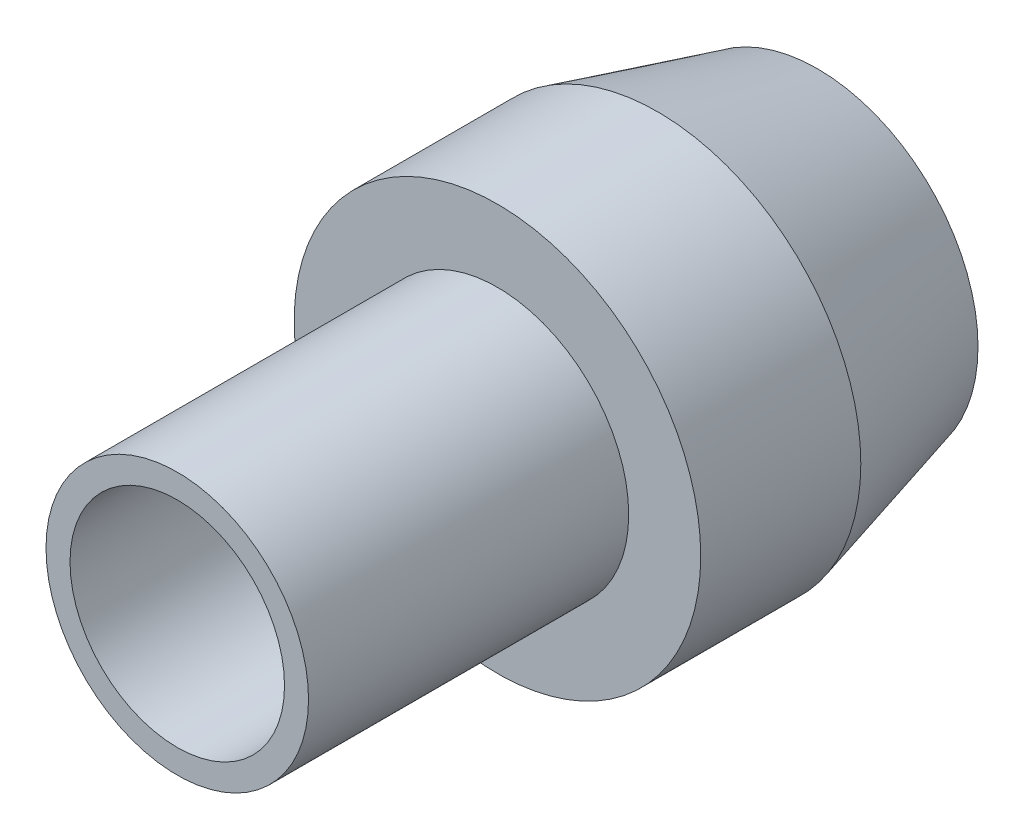
ISO-10303-21;
HEADER;
FILE_DESCRIPTION(('STEP AP214'),'2;1');
FILE_NAME('part.step','',(''),(''),'','','');
FILE_SCHEMA(('AUTOMOTIVE_DESIGN { 1 0 10303 214 1 1 1 1 }'));
ENDSEC;
DATA;
#1=APPLICATION_CONTEXT('core data for automotive mechanical design processes');
#2=APPLICATION_PROTOCOL_DEFINITION('international standard','automotive_design',2000,#1);
#3=PRODUCT_CONTEXT('',#1,'mechanical');
#4=PRODUCT('Part','Part','',(#3));
#5=PRODUCT_RELATED_PRODUCT_CATEGORY('part','',(#4));
#6=PRODUCT_DEFINITION_FORMATION('','',#4);
#7=PRODUCT_DEFINITION_CONTEXT('part definition',#1,'design');
#8=PRODUCT_DEFINITION('design','',#6,#7);
#9=PRODUCT_DEFINITION_SHAPE('','',#8);
#10=(LENGTH_UNIT() NAMED_UNIT(*) SI_UNIT(.MILLI.,.METRE.));
#11=(NAMED_UNIT(*) PLANE_ANGLE_UNIT() SI_UNIT($,.RADIAN.));
#12=(NAMED_UNIT(*) SI_UNIT($,.STERADIAN.) SOLID_ANGLE_UNIT());
#13=UNCERTAINTY_MEASURE_WITH_UNIT(LENGTH_MEASURE(1.E-05),#10,'distance_accuracy_value','');
#14=(GEOMETRIC_REPRESENTATION_CONTEXT(3) GLOBAL_UNCERTAINTY_ASSIGNED_CONTEXT((#13)) GLOBAL_UNIT_ASSIGNED_CONTEXT((#10,
#11,#12)) REPRESENTATION_CONTEXT('',''));
#15=CARTESIAN_POINT('',(0.,0.,0.));
#16=DIRECTION('',(0.,0.,1.));
#17=DIRECTION('',(1.,0.,0.));
#18=AXIS2_PLACEMENT_3D('',#15,#16,#17);
#19=CARTESIAN_POINT('',(0.,0.,20.));
#20=DIRECTION('',(0.,0.,1.));
#21=DIRECTION('',(1.,0.,0.));
#22=AXIS2_PLACEMENT_3D('',#19,#20,#21);
#23=PLANE('',#22);
#24=CARTESIAN_POINT('',(0.,0.,20.));
#25=DIRECTION('',(0.,0.,1.));
#26=DIRECTION('',(1.,0.,0.));
#27=AXIS2_PLACEMENT_3D('',#24,#25,#26);
#28=CIRCLE('',#27,12.7);
#29=CARTESIAN_POINT('',(12.7,0.,20.));
#30=VERTEX_POINT('',#29);
#31=EDGE_CURVE('E49',#30,#30,#28,.T.);
#32=ORIENTED_EDGE('',*,*,#31,.T.);
#33=EDGE_LOOP('',(#32));
#34=FACE_BOUND('',#33,.T.);
#35=CARTESIAN_POINT('',(0.,0.,20.));
#36=DIRECTION('',(0.,0.,1.));
#37=DIRECTION('',(1.,0.,0.));
#38=AXIS2_PLACEMENT_3D('',#35,#36,#37);
#39=CIRCLE('',#38,8.2);
#40=CARTESIAN_POINT('',(8.2,0.,20.));
#41=VERTEX_POINT('',#40);
#42=EDGE_CURVE('E59',#41,#41,#39,.T.);
#43=ORIENTED_EDGE('',*,*,#42,.F.);
#44=EDGE_LOOP('',(#43));
#45=FACE_BOUND('',#44,.T.);
#46=ADVANCED_FACE('F38',(#34,#45),#23,.T.);
#47=CARTESIAN_POINT('',(0.,0.,20.));
#48=DIRECTION('',(0.,0.,-1.));
#49=DIRECTION('',(-1.,0.,0.));
#50=AXIS2_PLACEMENT_3D('',#47,#48,#49);
#51=CYLINDRICAL_SURFACE('',#50,12.7);
#52=CARTESIAN_POINT('',(0.,0.,10.0000000000001));
#53=DIRECTION('',(0.,0.,1.));
#54=DIRECTION('',(1.,0.,0.));
#55=AXIS2_PLACEMENT_3D('',#52,#53,#54);
#56=CIRCLE('',#55,12.7);
#57=CARTESIAN_POINT('',(12.7,0.,10.0000000000001));
#58=VERTEX_POINT('',#57);
#59=EDGE_CURVE('E45',#58,#58,#56,.T.);
#60=ORIENTED_EDGE('',*,*,#59,.T.);
#61=EDGE_LOOP('',(#60));
#62=FACE_BOUND('',#61,.T.);
#63=ORIENTED_EDGE('',*,*,#31,.F.);
#64=EDGE_LOOP('',(#63));
#65=FACE_BOUND('',#64,.T.);
#66=ADVANCED_FACE('F84',(#62,#65),#51,.T.);
#67=CARTESIAN_POINT('',(0.,0.,20.));
#68=DIRECTION('',(0.,0.,-1.));
#69=DIRECTION('',(-1.,0.,0.));
#70=AXIS2_PLACEMENT_3D('',#67,#68,#69);
#71=CYLINDRICAL_SURFACE('',#70,6.7);
#72=CARTESIAN_POINT('',(0.,0.,0.));
#73=DIRECTION('',(0.,0.,1.));
#74=DIRECTION('',(1.,0.,0.));
#75=AXIS2_PLACEMENT_3D('',#72,#73,#74);
#76=CIRCLE('',#75,6.7);
#77=CARTESIAN_POINT('',(6.7,0.,0.));
#78=VERTEX_POINT('',#77);
#79=EDGE_CURVE('E53',#78,#78,#76,.T.);
#80=ORIENTED_EDGE('',*,*,#79,.F.);
#81=EDGE_LOOP('',(#80));
#82=FACE_BOUND('',#81,.T.);
#83=CARTESIAN_POINT('',(0.,0.,40.));
#84=DIRECTION('',(0.,0.,1.));
#85=DIRECTION('',(1.,0.,0.));
#86=AXIS2_PLACEMENT_3D('',#83,#84,#85);
#87=CIRCLE('',#86,6.7);
#88=CARTESIAN_POINT('',(6.7,0.,40.));
#89=VERTEX_POINT('',#88);
#90=EDGE_CURVE('E62',#89,#89,#87,.T.);
#91=ORIENTED_EDGE('',*,*,#90,.T.);
#92=EDGE_LOOP('',(#91));
#93=FACE_BOUND('',#92,.T.);
#94=ADVANCED_FACE('F68',(#82,#93),#71,.F.);
#95=CARTESIAN_POINT('',(0.,0.,0.));
#96=DIRECTION('',(0.,0.,1.));
#97=DIRECTION('',(1.,0.,0.));
#98=AXIS2_PLACEMENT_3D('',#95,#96,#97);
#99=PLANE('',#98);
#100=CARTESIAN_POINT('',(0.,0.,0.));
#101=DIRECTION('',(0.,0.,1.));
#102=DIRECTION('',(1.,0.,0.));
#103=AXIS2_PLACEMENT_3D('',#100,#101,#102);
#104=CIRCLE('',#103,10.0205080756888);
#105=CARTESIAN_POINT('',(10.0205080756888,0.,0.));
#106=VERTEX_POINT('',#105);
#107=EDGE_CURVE('E11',#106,#106,#104,.F.);
#108=ORIENTED_EDGE('',*,*,#107,.T.);
#109=EDGE_LOOP('',(#108));
#110=FACE_BOUND('',#109,.T.);
#111=ORIENTED_EDGE('',*,*,#79,.T.);
#112=EDGE_LOOP('',(#111));
#113=FACE_BOUND('',#112,.T.);
#114=ADVANCED_FACE('F73',(#110,#113),#99,.F.);
#115=CARTESIAN_POINT('',(0.,0.,40.));
#116=DIRECTION('',(0.,0.,1.));
#117=DIRECTION('',(1.,0.,0.));
#118=AXIS2_PLACEMENT_3D('',#115,#116,#117);
#119=PLANE('',#118);
#120=CARTESIAN_POINT('',(0.,0.,40.));
#121=DIRECTION('',(0.,0.,1.));
#122=DIRECTION('',(1.,0.,0.));
#123=AXIS2_PLACEMENT_3D('',#120,#121,#122);
#124=CIRCLE('',#123,8.2);
#125=CARTESIAN_POINT('',(8.2,0.,40.));
#126=VERTEX_POINT('',#125);
#127=EDGE_CURVE('E57',#126,#126,#124,.T.);
#128=ORIENTED_EDGE('',*,*,#127,.T.);
#129=EDGE_LOOP('',(#128));
#130=FACE_BOUND('',#129,.T.);
#131=ORIENTED_EDGE('',*,*,#90,.F.);
#132=EDGE_LOOP('',(#131));
#133=FACE_BOUND('',#132,.T.);
#134=ADVANCED_FACE('F70',(#130,#133),#119,.T.);
#135=CARTESIAN_POINT('',(0.,0.,40.));
#136=DIRECTION('',(0.,0.,-1.));
#137=DIRECTION('',(-1.,0.,0.));
#138=AXIS2_PLACEMENT_3D('',#135,#136,#137);
#139=CYLINDRICAL_SURFACE('',#138,8.2);
#140=ORIENTED_EDGE('',*,*,#127,.F.);
#141=EDGE_LOOP('',(#140));
#142=FACE_BOUND('',#141,.T.);
#143=ORIENTED_EDGE('',*,*,#42,.T.);
#144=EDGE_LOOP('',(#143));
#145=FACE_BOUND('',#144,.T.);
#146=ADVANCED_FACE('F72',(#142,#145),#139,.T.);
#147=CARTESIAN_POINT('',(0.,0.,10.0000000000001));
#148=DIRECTION('',(0.,0.,1.));
#149=DIRECTION('',(1.,0.,0.));
#150=AXIS2_PLACEMENT_3D('',#147,#148,#149);
#151=CONICAL_SURFACE('',#150,12.7,0.261799387799146);
#152=CARTESIAN_POINT('',(10.0205080756888,0.,0.));
#153=CARTESIAN_POINT('',(10.0484194499004,0.,0.104166666666666));
#154=CARTESIAN_POINT('',(10.0763308241119,0.,0.208333333333334));
#155=CARTESIAN_POINT('',(10.1321535725351,0.,0.41666666666667));
#156=CARTESIAN_POINT('',(10.1600649467467,0.,0.520833333333338));
#157=CARTESIAN_POINT('',(10.2158876951698,0.,0.729166666666673));
#158=CARTESIAN_POINT('',(10.2437990693814,0.,0.83333333333334));
#159=CARTESIAN_POINT('',(10.2996218178045,0.,1.04166666666668));
#160=CARTESIAN_POINT('',(10.3275331920161,0.,1.14583333333334));
#161=CARTESIAN_POINT('',(10.3833559404393,0.,1.35416666666668));
#162=CARTESIAN_POINT('',(10.4112673146508,0.,1.45833333333335));
#163=CARTESIAN_POINT('',(10.467090063074,0.,1.66666666666668));
#164=CARTESIAN_POINT('',(10.4950014372856,0.,1.77083333333335));
#165=CARTESIAN_POINT('',(10.5508241857087,0.,1.97916666666669));
#166=CARTESIAN_POINT('',(10.5787355599203,0.,2.08333333333335));
#167=CARTESIAN_POINT('',(10.6345583083434,0.,2.29166666666669));
#168=CARTESIAN_POINT('',(10.662469682555,0.,2.39583333333336));
#169=CARTESIAN_POINT('',(10.7182924309782,0.,2.60416666666669));
#170=CARTESIAN_POINT('',(10.7462038051897,0.,2.70833333333336));
#171=CARTESIAN_POINT('',(10.8020265536129,0.,2.9166666666667));
#172=CARTESIAN_POINT('',(10.8299379278245,0.,3.02083333333336));
#173=CARTESIAN_POINT('',(10.8857606762476,0.,3.2291666666667));
#174=CARTESIAN_POINT('',(10.9136720504592,0.,3.33333333333337));
#175=CARTESIAN_POINT('',(10.9694947988823,0.,3.5416666666667));
#176=CARTESIAN_POINT('',(10.9974061730939,0.,3.64583333333337));
#177=CARTESIAN_POINT('',(11.0532289215171,0.,3.85416666666671));
#178=CARTESIAN_POINT('',(11.0811402957286,0.,3.95833333333337));
#179=CARTESIAN_POINT('',(11.1369630441518,0.,4.16666666666671));
#180=CARTESIAN_POINT('',(11.1648744183634,0.,4.27083333333338));
#181=CARTESIAN_POINT('',(11.2206971667865,0.,4.47916666666671));
#182=CARTESIAN_POINT('',(11.2486085409981,0.,4.58333333333338));
#183=CARTESIAN_POINT('',(11.3044312894212,0.,4.79166666666672));
#184=CARTESIAN_POINT('',(11.3323426636328,0.,4.89583333333338));
#185=CARTESIAN_POINT('',(11.388165412056,0.,5.10416666666672));
#186=CARTESIAN_POINT('',(11.4160767862675,0.,5.20833333333339));
#187=CARTESIAN_POINT('',(11.4718995346907,0.,5.41666666666672));
#188=CARTESIAN_POINT('',(11.4998109089023,0.,5.52083333333339));
#189=CARTESIAN_POINT('',(11.5556336573254,0.,5.72916666666673));
#190=CARTESIAN_POINT('',(11.583545031537,0.,5.83333333333339));
#191=CARTESIAN_POINT('',(11.6393677799601,0.,6.04166666666673));
#192=CARTESIAN_POINT('',(11.6672791541717,0.,6.1458333333334));
#193=CARTESIAN_POINT('',(11.7231019025949,0.,6.35416666666673));
#194=CARTESIAN_POINT('',(11.7510132768064,0.,6.4583333333334));
#195=CARTESIAN_POINT('',(11.8068360252296,0.,6.66666666666674));
#196=CARTESIAN_POINT('',(11.8347473994412,0.,6.7708333333334));
#197=CARTESIAN_POINT('',(11.8905701478643,0.,6.97916666666674));
#198=CARTESIAN_POINT('',(11.9184815220759,0.,7.08333333333341));
#199=CARTESIAN_POINT('',(11.974304270499,0.,7.29166666666674));
#200=CARTESIAN_POINT('',(12.0022156447106,0.,7.39583333333341));
#201=CARTESIAN_POINT('',(12.0580383931338,0.,7.60416666666675));
#202=CARTESIAN_POINT('',(12.0859497673453,0.,7.70833333333341));
#203=CARTESIAN_POINT('',(12.1417725157685,0.,7.91666666666675));
#204=CARTESIAN_POINT('',(12.1696838899801,0.,8.02083333333342));
#205=CARTESIAN_POINT('',(12.2255066384032,0.,8.22916666666675));
#206=CARTESIAN_POINT('',(12.2534180126148,0.,8.33333333333342));
#207=CARTESIAN_POINT('',(12.3092407610379,0.,8.54166666666676));
#208=CARTESIAN_POINT('',(12.3371521352495,0.,8.64583333333343));
#209=CARTESIAN_POINT('',(12.3929748836727,0.,8.85416666666676));
#210=CARTESIAN_POINT('',(12.4208862578842,0.,8.95833333333343));
#211=CARTESIAN_POINT('',(12.4767090063074,0.,9.16666666666676));
#212=CARTESIAN_POINT('',(12.504620380519,0.,9.27083333333343));
#213=CARTESIAN_POINT('',(12.5604431289421,0.,9.47916666666677));
#214=CARTESIAN_POINT('',(12.5883545031537,0.,9.58333333333344));
#215=CARTESIAN_POINT('',(12.6441772515768,0.,9.79166666666677));
#216=CARTESIAN_POINT('',(12.6720886257884,0.,9.89583333333344));
#217=CARTESIAN_POINT('',(12.7,0.,10.0000000000001));
#218=B_SPLINE_CURVE_WITH_KNOTS('',3,(#152,#153,#154,#155,#156,#157,#158,#159,#160,#161,#162,
#163,#164,#165,#166,#167,#168,#169,#170,#171,#172,#173,#174,#175,#176,#177,#178,#179,#180,#181,
#182,#183,#184,#185,#186,#187,#188,#189,#190,#191,#192,#193,#194,#195,#196,#197,#198,#199,#200,
#201,#202,#203,#204,#205,#206,#207,#208,#209,#210,#211,#212,#213,#214,#215,#216,#217),
.UNSPECIFIED.,.F.,.F.,(4,2,2,2,2,2,2,2,2,2,2,2,2,2,2,2,2,2,2,2,2,2,2,2,2,2,2,2,2,2,2,2,4),(0.,
0.323523806378154,0.647047612756309,0.970571419134462,1.29409522551262,1.61761903189077,
1.94114283826893,2.26466664464708,2.58819045102523,2.91171425740339,3.23523806378154,
3.5587618701597,3.88228567653785,4.205809482916,4.52933328929416,4.85285709567231,
5.17638090205047,5.49990470842862,5.82342851480677,6.14695232118493,6.47047612756308,
6.79399993394123,7.11752374031939,7.44104754669755,7.7645713530757,8.08809515945385,
8.41161896583201,8.73514277221016,9.05866657858832,9.38219038496647,9.70571419134462,
10.0292379977228,10.3527618041009),.UNSPECIFIED.);
#219=EDGE_CURVE('BSEAM40',#106,#58,#218,.T.);
#220=ORIENTED_EDGE('',*,*,#107,.F.);
#221=ORIENTED_EDGE('',*,*,#59,.F.);
#222=ORIENTED_EDGE('',*,*,#219,.T.);
#223=ORIENTED_EDGE('',*,*,#219,.F.);
#224=EDGE_LOOP('',(#220,#222,#221,#223));
#225=FACE_BOUND('',#224,.T.);
#226=ADVANCED_FACE('F40',(#225),#151,.T.);
#227=CLOSED_SHELL('',(#46,#66,#94,#114,#134,#146,#226));
#228=MANIFOLD_SOLID_BREP('B2',#227);
#229=ADVANCED_BREP_SHAPE_REPRESENTATION('',(#18,#228),#14);
#230=SHAPE_DEFINITION_REPRESENTATION(#9,#229);
ENDSEC;
END-ISO-10303-21;
